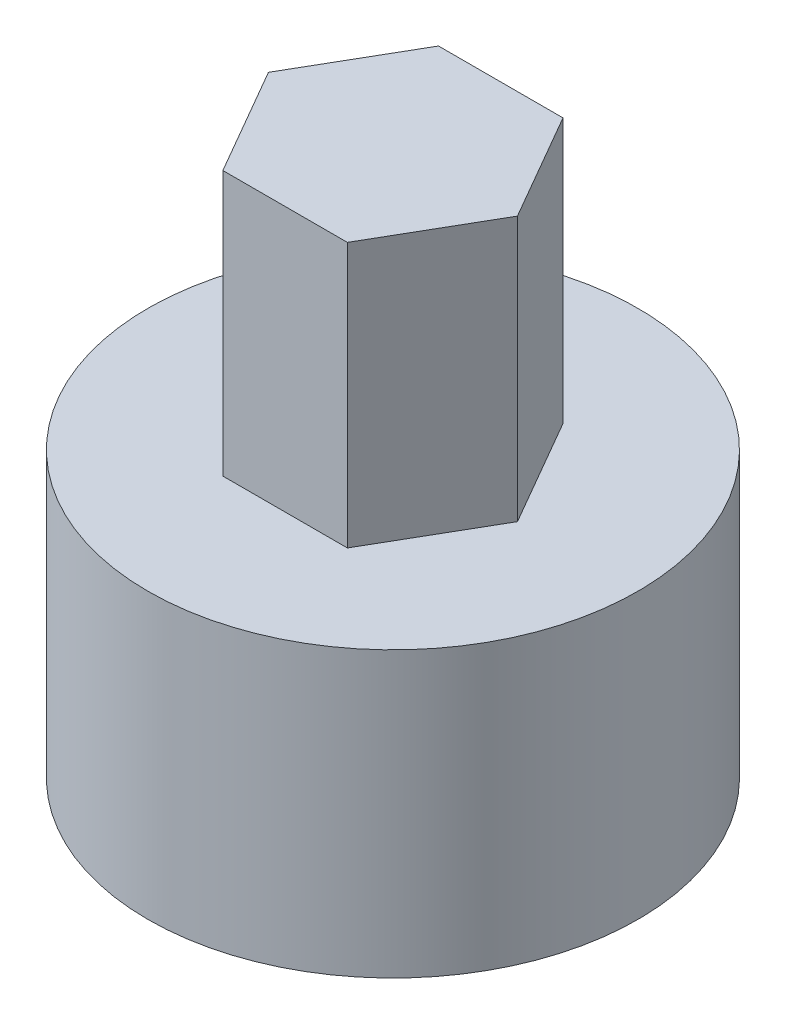
ISO-10303-21;
HEADER;
FILE_DESCRIPTION(('STEP AP214'),'2;1');
FILE_NAME('part.step','',(''),(''),'','','');
FILE_SCHEMA(('AUTOMOTIVE_DESIGN { 1 0 10303 214 1 1 1 1 }'));
ENDSEC;
DATA;
#1=APPLICATION_CONTEXT('core data for automotive mechanical design processes');
#2=APPLICATION_PROTOCOL_DEFINITION('international standard','automotive_design',2000,#1);
#3=PRODUCT_CONTEXT('',#1,'mechanical');
#4=PRODUCT('Part','Part','',(#3));
#5=PRODUCT_RELATED_PRODUCT_CATEGORY('part','',(#4));
#6=PRODUCT_DEFINITION_FORMATION('','',#4);
#7=PRODUCT_DEFINITION_CONTEXT('part definition',#1,'design');
#8=PRODUCT_DEFINITION('design','',#6,#7);
#9=PRODUCT_DEFINITION_SHAPE('','',#8);
#10=(LENGTH_UNIT() NAMED_UNIT(*) SI_UNIT(.MILLI.,.METRE.));
#11=(NAMED_UNIT(*) PLANE_ANGLE_UNIT() SI_UNIT($,.RADIAN.));
#12=(NAMED_UNIT(*) SI_UNIT($,.STERADIAN.) SOLID_ANGLE_UNIT());
#13=UNCERTAINTY_MEASURE_WITH_UNIT(LENGTH_MEASURE(1.E-05),#10,'distance_accuracy_value','');
#14=(GEOMETRIC_REPRESENTATION_CONTEXT(3) GLOBAL_UNCERTAINTY_ASSIGNED_CONTEXT((#13)) GLOBAL_UNIT_ASSIGNED_CONTEXT((#10,
#11,#12)) REPRESENTATION_CONTEXT('',''));
#15=CARTESIAN_POINT('',(0.,0.,0.));
#16=DIRECTION('',(0.,0.,1.));
#17=DIRECTION('',(1.,0.,0.));
#18=AXIS2_PLACEMENT_3D('',#15,#16,#17);
#19=CARTESIAN_POINT('',(-0.635085296108588,2.7,-1.1));
#20=DIRECTION('',(0.866025403784439,0.,0.5));
#21=DIRECTION('',(0.5,0.,-0.866025403784439));
#22=AXIS2_PLACEMENT_3D('',#19,#20,#21);
#23=PLANE('',#22);
#24=DIRECTION('',(-0.5,0.,0.866025403784439));
#25=VECTOR('',#24,1.);
#26=CARTESIAN_POINT('',(-0.635085296108588,0.,-1.1));
#27=LINE('',#26,#25);
#28=CARTESIAN_POINT('',(-0.635085296108588,0.,-1.1));
#29=VERTEX_POINT('',#28);
#30=CARTESIAN_POINT('',(-1.27017059221718,0.,0.));
#31=VERTEX_POINT('',#30);
#32=EDGE_CURVE('E90',#29,#31,#27,.T.);
#33=ORIENTED_EDGE('',*,*,#32,.T.);
#34=DIRECTION('',(0.,-1.,0.));
#35=VECTOR('',#34,1.);
#36=CARTESIAN_POINT('',(-1.27017059221718,2.7,0.));
#37=LINE('',#36,#35);
#38=CARTESIAN_POINT('',(-1.27017059221718,2.7,0.));
#39=VERTEX_POINT('',#38);
#40=EDGE_CURVE('E12',#39,#31,#37,.T.);
#41=ORIENTED_EDGE('',*,*,#40,.F.);
#42=DIRECTION('',(-0.5,0.,0.866025403784439));
#43=VECTOR('',#42,1.);
#44=CARTESIAN_POINT('',(-0.635085296108588,2.7,-1.1));
#45=LINE('',#44,#43);
#46=CARTESIAN_POINT('',(-0.635085296108588,2.7,-1.1));
#47=VERTEX_POINT('',#46);
#48=EDGE_CURVE('E141',#47,#39,#45,.T.);
#49=ORIENTED_EDGE('',*,*,#48,.F.);
#50=DIRECTION('',(0.,-1.,0.));
#51=VECTOR('',#50,1.);
#52=CARTESIAN_POINT('',(-0.635085296108588,2.7,-1.1));
#53=LINE('',#52,#51);
#54=EDGE_CURVE('E127',#47,#29,#53,.T.);
#55=ORIENTED_EDGE('',*,*,#54,.T.);
#56=EDGE_LOOP('',(#33,#41,#49,#55));
#57=FACE_BOUND('',#56,.T.);
#58=ADVANCED_FACE('F44',(#57),#23,.F.);
#59=CARTESIAN_POINT('',(-1.27017059221718,2.7,0.));
#60=DIRECTION('',(0.866025403784439,0.,-0.5));
#61=DIRECTION('',(-0.5,0.,-0.866025403784439));
#62=AXIS2_PLACEMENT_3D('',#59,#60,#61);
#63=PLANE('',#62);
#64=DIRECTION('',(0.5,0.,0.866025403784439));
#65=VECTOR('',#64,1.);
#66=CARTESIAN_POINT('',(-1.27017059221718,0.,0.));
#67=LINE('',#66,#65);
#68=CARTESIAN_POINT('',(-0.635085296108588,0.,1.1));
#69=VERTEX_POINT('',#68);
#70=EDGE_CURVE('E132',#31,#69,#67,.T.);
#71=ORIENTED_EDGE('',*,*,#70,.T.);
#72=DIRECTION('',(0.,-1.,0.));
#73=VECTOR('',#72,1.);
#74=CARTESIAN_POINT('',(-0.635085296108588,2.7,1.1));
#75=LINE('',#74,#73);
#76=CARTESIAN_POINT('',(-0.635085296108588,2.7,1.1));
#77=VERTEX_POINT('',#76);
#78=EDGE_CURVE('E51',#77,#69,#75,.T.);
#79=ORIENTED_EDGE('',*,*,#78,.F.);
#80=DIRECTION('',(0.5,0.,0.866025403784439));
#81=VECTOR('',#80,1.);
#82=CARTESIAN_POINT('',(-1.27017059221718,2.7,0.));
#83=LINE('',#82,#81);
#84=EDGE_CURVE('E152',#39,#77,#83,.T.);
#85=ORIENTED_EDGE('',*,*,#84,.F.);
#86=ORIENTED_EDGE('',*,*,#40,.T.);
#87=EDGE_LOOP('',(#71,#79,#85,#86));
#88=FACE_BOUND('',#87,.T.);
#89=ADVANCED_FACE('F151',(#88),#63,.F.);
#90=CARTESIAN_POINT('',(-0.635085296108588,2.7,1.1));
#91=DIRECTION('',(0.,0.,-1.));
#92=DIRECTION('',(-1.,0.,0.));
#93=AXIS2_PLACEMENT_3D('',#90,#91,#92);
#94=PLANE('',#93);
#95=DIRECTION('',(1.,0.,0.));
#96=VECTOR('',#95,1.);
#97=CARTESIAN_POINT('',(-0.635085296108588,0.,1.1));
#98=LINE('',#97,#96);
#99=CARTESIAN_POINT('',(0.635085296108588,0.,1.1));
#100=VERTEX_POINT('',#99);
#101=EDGE_CURVE('E80',#69,#100,#98,.T.);
#102=ORIENTED_EDGE('',*,*,#101,.T.);
#103=DIRECTION('',(0.,-1.,0.));
#104=VECTOR('',#103,1.);
#105=CARTESIAN_POINT('',(0.635085296108588,2.7,1.1));
#106=LINE('',#105,#104);
#107=CARTESIAN_POINT('',(0.635085296108588,2.7,1.1));
#108=VERTEX_POINT('',#107);
#109=EDGE_CURVE('E121',#108,#100,#106,.T.);
#110=ORIENTED_EDGE('',*,*,#109,.F.);
#111=DIRECTION('',(1.,0.,0.));
#112=VECTOR('',#111,1.);
#113=CARTESIAN_POINT('',(-0.635085296108588,2.7,1.1));
#114=LINE('',#113,#112);
#115=EDGE_CURVE('E109',#77,#108,#114,.T.);
#116=ORIENTED_EDGE('',*,*,#115,.F.);
#117=ORIENTED_EDGE('',*,*,#78,.T.);
#118=EDGE_LOOP('',(#102,#110,#116,#117));
#119=FACE_BOUND('',#118,.T.);
#120=ADVANCED_FACE('F148',(#119),#94,.F.);
#121=CARTESIAN_POINT('',(0.635085296108588,2.7,1.1));
#122=DIRECTION('',(-0.866025403784439,0.,-0.5));
#123=DIRECTION('',(-0.5,0.,0.866025403784439));
#124=AXIS2_PLACEMENT_3D('',#121,#122,#123);
#125=PLANE('',#124);
#126=DIRECTION('',(0.5,0.,-0.866025403784439));
#127=VECTOR('',#126,1.);
#128=CARTESIAN_POINT('',(0.635085296108588,0.,1.1));
#129=LINE('',#128,#127);
#130=CARTESIAN_POINT('',(1.27017059221718,0.,0.));
#131=VERTEX_POINT('',#130);
#132=EDGE_CURVE('E118',#100,#131,#129,.T.);
#133=ORIENTED_EDGE('',*,*,#132,.T.);
#134=DIRECTION('',(0.,-1.,0.));
#135=VECTOR('',#134,1.);
#136=CARTESIAN_POINT('',(1.27017059221718,2.7,0.));
#137=LINE('',#136,#135);
#138=CARTESIAN_POINT('',(1.27017059221718,2.7,0.));
#139=VERTEX_POINT('',#138);
#140=EDGE_CURVE('E116',#139,#131,#137,.T.);
#141=ORIENTED_EDGE('',*,*,#140,.F.);
#142=DIRECTION('',(0.5,0.,-0.866025403784439));
#143=VECTOR('',#142,1.);
#144=CARTESIAN_POINT('',(0.635085296108588,2.7,1.1));
#145=LINE('',#144,#143);
#146=EDGE_CURVE('E102',#108,#139,#145,.T.);
#147=ORIENTED_EDGE('',*,*,#146,.F.);
#148=ORIENTED_EDGE('',*,*,#109,.T.);
#149=EDGE_LOOP('',(#133,#141,#147,#148));
#150=FACE_BOUND('',#149,.T.);
#151=ADVANCED_FACE('F117',(#150),#125,.F.);
#152=CARTESIAN_POINT('',(1.27017059221718,2.7,0.));
#153=DIRECTION('',(-0.866025403784439,0.,0.5));
#154=DIRECTION('',(0.5,0.,0.866025403784439));
#155=AXIS2_PLACEMENT_3D('',#152,#153,#154);
#156=PLANE('',#155);
#157=DIRECTION('',(-0.5,0.,-0.866025403784439));
#158=VECTOR('',#157,1.);
#159=CARTESIAN_POINT('',(1.27017059221718,0.,0.));
#160=LINE('',#159,#158);
#161=CARTESIAN_POINT('',(0.635085296108588,0.,-1.1));
#162=VERTEX_POINT('',#161);
#163=EDGE_CURVE('E137',#131,#162,#160,.T.);
#164=ORIENTED_EDGE('',*,*,#163,.T.);
#165=DIRECTION('',(0.,-1.,0.));
#166=VECTOR('',#165,1.);
#167=CARTESIAN_POINT('',(0.635085296108588,2.7,-1.1));
#168=LINE('',#167,#166);
#169=CARTESIAN_POINT('',(0.635085296108588,2.7,-1.1));
#170=VERTEX_POINT('',#169);
#171=EDGE_CURVE('E122',#170,#162,#168,.T.);
#172=ORIENTED_EDGE('',*,*,#171,.F.);
#173=DIRECTION('',(-0.5,0.,-0.866025403784439));
#174=VECTOR('',#173,1.);
#175=CARTESIAN_POINT('',(1.27017059221718,2.7,0.));
#176=LINE('',#175,#174);
#177=EDGE_CURVE('E106',#139,#170,#176,.T.);
#178=ORIENTED_EDGE('',*,*,#177,.F.);
#179=ORIENTED_EDGE('',*,*,#140,.T.);
#180=EDGE_LOOP('',(#164,#172,#178,#179));
#181=FACE_BOUND('',#180,.T.);
#182=ADVANCED_FACE('F124',(#181),#156,.F.);
#183=CARTESIAN_POINT('',(0.635085296108588,2.7,-1.1));
#184=DIRECTION('',(0.,0.,1.));
#185=DIRECTION('',(1.,0.,0.));
#186=AXIS2_PLACEMENT_3D('',#183,#184,#185);
#187=PLANE('',#186);
#188=DIRECTION('',(-1.,0.,0.));
#189=VECTOR('',#188,1.);
#190=CARTESIAN_POINT('',(0.635085296108588,0.,-1.1));
#191=LINE('',#190,#189);
#192=EDGE_CURVE('E139',#162,#29,#191,.T.);
#193=ORIENTED_EDGE('',*,*,#192,.T.);
#194=ORIENTED_EDGE('',*,*,#54,.F.);
#195=DIRECTION('',(-1.,0.,0.));
#196=VECTOR('',#195,1.);
#197=CARTESIAN_POINT('',(0.635085296108588,2.7,-1.1));
#198=LINE('',#197,#196);
#199=EDGE_CURVE('E67',#170,#47,#198,.T.);
#200=ORIENTED_EDGE('',*,*,#199,.F.);
#201=ORIENTED_EDGE('',*,*,#171,.T.);
#202=EDGE_LOOP('',(#193,#194,#200,#201));
#203=FACE_BOUND('',#202,.T.);
#204=ADVANCED_FACE('F165',(#203),#187,.F.);
#205=CARTESIAN_POINT('',(0.,2.7,0.));
#206=DIRECTION('',(0.,1.,0.));
#207=DIRECTION('',(0.,0.,1.));
#208=AXIS2_PLACEMENT_3D('',#205,#206,#207);
#209=PLANE('',#208);
#210=ORIENTED_EDGE('',*,*,#48,.T.);
#211=ORIENTED_EDGE('',*,*,#84,.T.);
#212=ORIENTED_EDGE('',*,*,#115,.T.);
#213=ORIENTED_EDGE('',*,*,#146,.T.);
#214=ORIENTED_EDGE('',*,*,#177,.T.);
#215=ORIENTED_EDGE('',*,*,#199,.T.);
#216=EDGE_LOOP('',(#210,#211,#212,#213,#214,#215));
#217=FACE_BOUND('',#216,.T.);
#218=ADVANCED_FACE('F104',(#217),#209,.T.);
#219=CARTESIAN_POINT('',(0.,0.,0.));
#220=DIRECTION('',(0.,1.,0.));
#221=DIRECTION('',(0.,0.,1.));
#222=AXIS2_PLACEMENT_3D('',#219,#220,#221);
#223=PLANE('',#222);
#224=CARTESIAN_POINT('',(0.,0.,0.));
#225=DIRECTION('',(0.,1.,0.));
#226=DIRECTION('',(0.,0.,1.));
#227=AXIS2_PLACEMENT_3D('',#224,#225,#226);
#228=CIRCLE('',#227,2.5);
#229=CARTESIAN_POINT('',(0.,0.,2.5));
#230=VERTEX_POINT('',#229);
#231=EDGE_CURVE('E133',#230,#230,#228,.T.);
#232=ORIENTED_EDGE('',*,*,#231,.T.);
#233=EDGE_LOOP('',(#232));
#234=FACE_BOUND('',#233,.T.);
#235=ORIENTED_EDGE('',*,*,#32,.F.);
#236=ORIENTED_EDGE('',*,*,#192,.F.);
#237=ORIENTED_EDGE('',*,*,#163,.F.);
#238=ORIENTED_EDGE('',*,*,#132,.F.);
#239=ORIENTED_EDGE('',*,*,#101,.F.);
#240=ORIENTED_EDGE('',*,*,#70,.F.);
#241=EDGE_LOOP('',(#235,#236,#237,#238,#239,#240));
#242=FACE_BOUND('',#241,.T.);
#243=ADVANCED_FACE('F155',(#234,#242),#223,.T.);
#244=CARTESIAN_POINT('',(0.,-0.9,0.));
#245=DIRECTION('',(0.,1.,0.));
#246=DIRECTION('',(0.,0.,1.));
#247=AXIS2_PLACEMENT_3D('',#244,#245,#246);
#248=CYLINDRICAL_SURFACE('',#247,2.5);
#249=ORIENTED_EDGE('',*,*,#231,.F.);
#250=EDGE_LOOP('',(#249));
#251=FACE_BOUND('',#250,.T.);
#252=CARTESIAN_POINT('',(0.,-2.9,0.));
#253=DIRECTION('',(0.,1.,0.));
#254=DIRECTION('',(0.,0.,1.));
#255=AXIS2_PLACEMENT_3D('',#252,#253,#254);
#256=CIRCLE('',#255,2.5);
#257=CARTESIAN_POINT('',(0.,-2.9,2.5));
#258=VERTEX_POINT('',#257);
#259=EDGE_CURVE('E173',#258,#258,#256,.T.);
#260=ORIENTED_EDGE('',*,*,#259,.T.);
#261=EDGE_LOOP('',(#260));
#262=FACE_BOUND('',#261,.T.);
#263=ADVANCED_FACE('F227',(#251,#262),#248,.T.);
#264=CARTESIAN_POINT('',(0.,-2.9,0.));
#265=DIRECTION('',(0.,1.,0.));
#266=DIRECTION('',(0.,0.,1.));
#267=AXIS2_PLACEMENT_3D('',#264,#265,#266);
#268=PLANE('',#267);
#269=DIRECTION('',(0.,0.,1.));
#270=VECTOR('',#269,1.);
#271=CARTESIAN_POINT('',(1.,-2.9,0.));
#272=LINE('',#271,#270);
#273=CARTESIAN_POINT('',(1.,-2.9,-1.31244047484067));
#274=VERTEX_POINT('',#273);
#275=CARTESIAN_POINT('',(1.,-2.9,1.31244047484067));
#276=VERTEX_POINT('',#275);
#277=EDGE_CURVE('E178',#274,#276,#272,.T.);
#278=ORIENTED_EDGE('',*,*,#277,.F.);
#279=CARTESIAN_POINT('',(0.,-2.9,0.));
#280=DIRECTION('',(0.,1.,0.));
#281=DIRECTION('',(0.,0.,1.));
#282=AXIS2_PLACEMENT_3D('',#279,#280,#281);
#283=CIRCLE('',#282,1.65);
#284=EDGE_CURVE('E184',#274,#276,#283,.T.);
#285=ORIENTED_EDGE('',*,*,#284,.T.);
#286=EDGE_LOOP('',(#278,#285));
#287=FACE_BOUND('',#286,.T.);
#288=ORIENTED_EDGE('',*,*,#259,.F.);
#289=EDGE_LOOP('',(#288));
#290=FACE_BOUND('',#289,.T.);
#291=ADVANCED_FACE('F191',(#287,#290),#268,.F.);
#292=CARTESIAN_POINT('',(0.,-2.9,0.));
#293=DIRECTION('',(0.,1.,0.));
#294=DIRECTION('',(0.,0.,1.));
#295=AXIS2_PLACEMENT_3D('',#292,#293,#294);
#296=CYLINDRICAL_SURFACE('',#295,1.65);
#297=CARTESIAN_POINT('',(0.,-0.9,0.));
#298=DIRECTION('',(0.,1.,0.));
#299=DIRECTION('',(0.,0.,1.));
#300=AXIS2_PLACEMENT_3D('',#297,#298,#299);
#301=CIRCLE('',#300,1.65);
#302=CARTESIAN_POINT('',(1.,-0.9,-1.31244047484067));
#303=VERTEX_POINT('',#302);
#304=CARTESIAN_POINT('',(1.,-0.9,1.31244047484067));
#305=VERTEX_POINT('',#304);
#306=EDGE_CURVE('E185',#303,#305,#301,.T.);
#307=ORIENTED_EDGE('',*,*,#306,.T.);
#308=DIRECTION('',(0.,1.,0.));
#309=VECTOR('',#308,1.);
#310=CARTESIAN_POINT('',(1.,-2.9,1.31244047484067));
#311=LINE('',#310,#309);
#312=EDGE_CURVE('E58',#276,#305,#311,.T.);
#313=ORIENTED_EDGE('',*,*,#312,.F.);
#314=ORIENTED_EDGE('',*,*,#284,.F.);
#315=DIRECTION('',(0.,1.,0.));
#316=VECTOR('',#315,1.);
#317=CARTESIAN_POINT('',(1.,-2.9,-1.31244047484067));
#318=LINE('',#317,#316);
#319=EDGE_CURVE('E176',#274,#303,#318,.T.);
#320=ORIENTED_EDGE('',*,*,#319,.T.);
#321=EDGE_LOOP('',(#307,#313,#314,#320));
#322=FACE_BOUND('',#321,.T.);
#323=ADVANCED_FACE('F197',(#322),#296,.F.);
#324=CARTESIAN_POINT('',(1.,-2.9,0.));
#325=DIRECTION('',(-1.,0.,0.));
#326=DIRECTION('',(0.,0.,1.));
#327=AXIS2_PLACEMENT_3D('',#324,#325,#326);
#328=PLANE('',#327);
#329=DIRECTION('',(0.,0.,1.));
#330=VECTOR('',#329,1.);
#331=CARTESIAN_POINT('',(1.,-0.9,0.));
#332=LINE('',#331,#330);
#333=EDGE_CURVE('E181',#303,#305,#332,.T.);
#334=ORIENTED_EDGE('',*,*,#333,.F.);
#335=ORIENTED_EDGE('',*,*,#319,.F.);
#336=ORIENTED_EDGE('',*,*,#277,.T.);
#337=ORIENTED_EDGE('',*,*,#312,.T.);
#338=EDGE_LOOP('',(#334,#335,#336,#337));
#339=FACE_BOUND('',#338,.T.);
#340=ADVANCED_FACE('F198',(#339),#328,.T.);
#341=CARTESIAN_POINT('',(0.,-0.9,0.));
#342=DIRECTION('',(0.,1.,0.));
#343=DIRECTION('',(0.,0.,1.));
#344=AXIS2_PLACEMENT_3D('',#341,#342,#343);
#345=PLANE('',#344);
#346=ORIENTED_EDGE('',*,*,#306,.F.);
#347=ORIENTED_EDGE('',*,*,#333,.T.);
#348=EDGE_LOOP('',(#346,#347));
#349=FACE_BOUND('',#348,.T.);
#350=ADVANCED_FACE('F201',(#349),#345,.F.);
#351=CLOSED_SHELL('',(#58,#89,#120,#151,#182,#204,#218,#243,#263,#291,#323,#340,#350));
#352=MANIFOLD_SOLID_BREP('B2',#351);
#353=ADVANCED_BREP_SHAPE_REPRESENTATION('',(#18,#352),#14);
#354=SHAPE_DEFINITION_REPRESENTATION(#9,#353);
ENDSEC;
END-ISO-10303-21;
